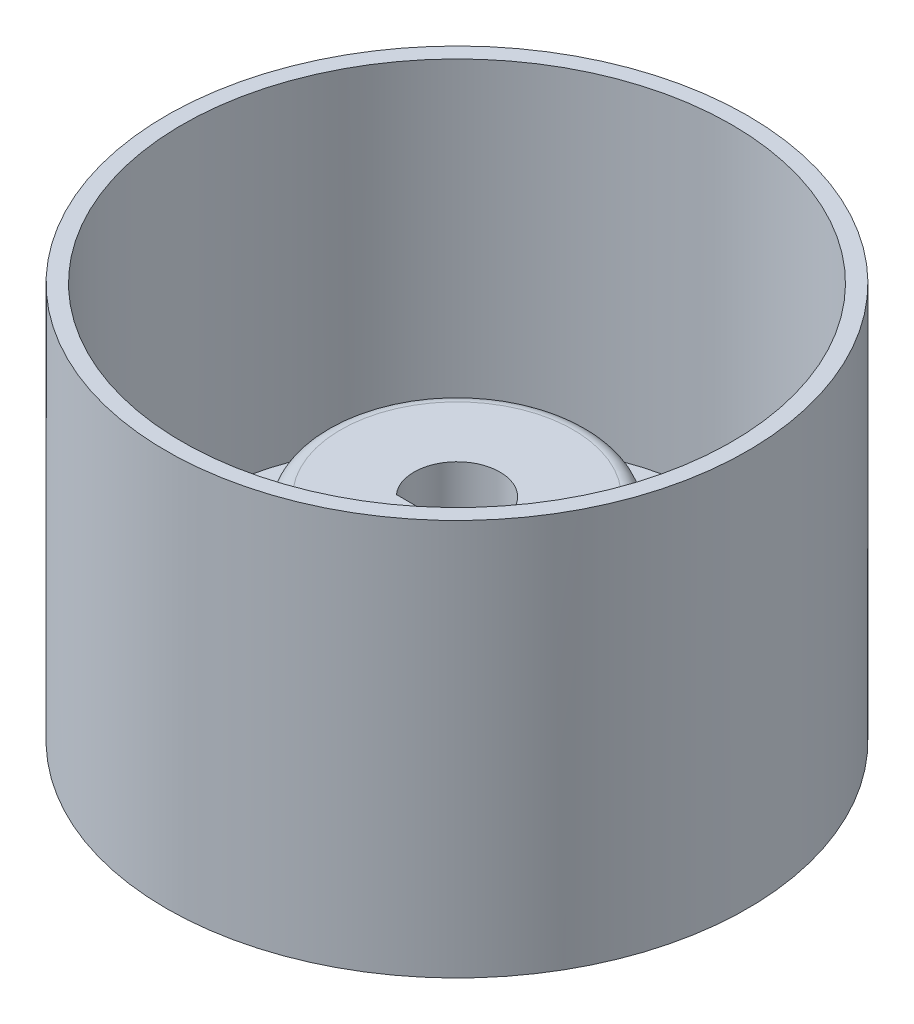
ISO-10303-21;
HEADER;
FILE_DESCRIPTION(('STEP AP214'),'2;1');
FILE_NAME('part.step','',(''),(''),'','','');
FILE_SCHEMA(('AUTOMOTIVE_DESIGN { 1 0 10303 214 1 1 1 1 }'));
ENDSEC;
DATA;
#1=APPLICATION_CONTEXT('core data for automotive mechanical design processes');
#2=APPLICATION_PROTOCOL_DEFINITION('international standard','automotive_design',2000,#1);
#3=PRODUCT_CONTEXT('',#1,'mechanical');
#4=PRODUCT('Part','Part','',(#3));
#5=PRODUCT_RELATED_PRODUCT_CATEGORY('part','',(#4));
#6=PRODUCT_DEFINITION_FORMATION('','',#4);
#7=PRODUCT_DEFINITION_CONTEXT('part definition',#1,'design');
#8=PRODUCT_DEFINITION('design','',#6,#7);
#9=PRODUCT_DEFINITION_SHAPE('','',#8);
#10=(LENGTH_UNIT() NAMED_UNIT(*) SI_UNIT(.MILLI.,.METRE.));
#11=(NAMED_UNIT(*) PLANE_ANGLE_UNIT() SI_UNIT($,.RADIAN.));
#12=(NAMED_UNIT(*) SI_UNIT($,.STERADIAN.) SOLID_ANGLE_UNIT());
#13=UNCERTAINTY_MEASURE_WITH_UNIT(LENGTH_MEASURE(1.E-05),#10,'distance_accuracy_value','');
#14=(GEOMETRIC_REPRESENTATION_CONTEXT(3) GLOBAL_UNCERTAINTY_ASSIGNED_CONTEXT((#13)) GLOBAL_UNIT_ASSIGNED_CONTEXT((#10,
#11,#12)) REPRESENTATION_CONTEXT('',''));
#15=CARTESIAN_POINT('',(0.,0.,0.));
#16=DIRECTION('',(0.,0.,1.));
#17=DIRECTION('',(1.,0.,0.));
#18=AXIS2_PLACEMENT_3D('',#15,#16,#17);
#19=CARTESIAN_POINT('',(0.,2.5,0.));
#20=DIRECTION('',(0.,1.,0.));
#21=DIRECTION('',(0.,0.,1.));
#22=AXIS2_PLACEMENT_3D('',#19,#20,#21);
#23=PLANE('',#22);
#24=CARTESIAN_POINT('',(-6.928203230275,2.5,4.0000000000003));
#25=DIRECTION('',(0.,1.,0.));
#26=DIRECTION('',(0.,0.,1.));
#27=AXIS2_PLACEMENT_3D('',#24,#25,#26);
#28=CIRCLE('',#27,1.53000000000065);
#29=CARTESIAN_POINT('',(-6.928203230275,2.5,5.53000000000094));
#30=VERTEX_POINT('',#29);
#31=EDGE_CURVE('E72',#30,#30,#28,.T.);
#32=ORIENTED_EDGE('',*,*,#31,.F.);
#33=EDGE_LOOP('',(#32));
#34=FACE_BOUND('',#33,.T.);
#35=CARTESIAN_POINT('',(6.92820323027602,2.5,3.9999999999997));
#36=DIRECTION('',(0.,1.,0.));
#37=DIRECTION('',(0.,0.,1.));
#38=AXIS2_PLACEMENT_3D('',#35,#36,#37);
#39=CIRCLE('',#38,1.53000000000044);
#40=CARTESIAN_POINT('',(6.92820323027602,2.5,5.53000000000014));
#41=VERTEX_POINT('',#40);
#42=EDGE_CURVE('E108',#41,#41,#39,.T.);
#43=ORIENTED_EDGE('',*,*,#42,.F.);
#44=EDGE_LOOP('',(#43));
#45=FACE_BOUND('',#44,.T.);
#46=CARTESIAN_POINT('',(0.,2.5,-8.));
#47=DIRECTION('',(0.,1.,0.));
#48=DIRECTION('',(0.,0.,1.));
#49=AXIS2_PLACEMENT_3D('',#46,#47,#48);
#50=CIRCLE('',#49,1.53);
#51=CARTESIAN_POINT('',(0.,2.5,-6.47));
#52=VERTEX_POINT('',#51);
#53=EDGE_CURVE('E100',#52,#52,#50,.T.);
#54=ORIENTED_EDGE('',*,*,#53,.F.);
#55=EDGE_LOOP('',(#54));
#56=FACE_BOUND('',#55,.T.);
#57=CARTESIAN_POINT('',(0.,2.5,0.));
#58=DIRECTION('',(0.,1.,0.));
#59=DIRECTION('',(0.,0.,1.));
#60=AXIS2_PLACEMENT_3D('',#57,#58,#59);
#61=CIRCLE('',#60,5.6);
#62=CARTESIAN_POINT('',(0.,2.5,5.6));
#63=VERTEX_POINT('',#62);
#64=EDGE_CURVE('E11',#63,#63,#61,.F.);
#65=ORIENTED_EDGE('',*,*,#64,.T.);
#66=EDGE_LOOP('',(#65));
#67=FACE_BOUND('',#66,.T.);
#68=CARTESIAN_POINT('',(0.,2.5,0.));
#69=DIRECTION('',(0.,1.,0.));
#70=DIRECTION('',(0.,0.,1.));
#71=AXIS2_PLACEMENT_3D('',#68,#69,#70);
#72=CIRCLE('',#71,10.4);
#73=CARTESIAN_POINT('',(0.,2.5,10.4));
#74=VERTEX_POINT('',#73);
#75=EDGE_CURVE('E83',#74,#74,#72,.T.);
#76=ORIENTED_EDGE('',*,*,#75,.T.);
#77=EDGE_LOOP('',(#76));
#78=FACE_BOUND('',#77,.T.);
#79=ADVANCED_FACE('F39',(#34,#45,#56,#67,#78),#23,.T.);
#80=CARTESIAN_POINT('',(0.,2.5,0.));
#81=DIRECTION('',(0.,-1.,0.));
#82=DIRECTION('',(0.,0.,-1.));
#83=AXIS2_PLACEMENT_3D('',#80,#81,#82);
#84=CYLINDRICAL_SURFACE('',#83,11.);
#85=CARTESIAN_POINT('',(0.,0.,0.));
#86=DIRECTION('',(0.,1.,0.));
#87=DIRECTION('',(0.,0.,1.));
#88=AXIS2_PLACEMENT_3D('',#85,#86,#87);
#89=CIRCLE('',#88,11.);
#90=CARTESIAN_POINT('',(0.,0.,11.));
#91=VERTEX_POINT('',#90);
#92=EDGE_CURVE('E99',#91,#91,#89,.T.);
#93=ORIENTED_EDGE('',*,*,#92,.T.);
#94=EDGE_LOOP('',(#93));
#95=FACE_BOUND('',#94,.T.);
#96=CARTESIAN_POINT('',(0.,15.,0.));
#97=DIRECTION('',(0.,-1.,0.));
#98=DIRECTION('',(0.,0.,-1.));
#99=AXIS2_PLACEMENT_3D('',#96,#97,#98);
#100=CIRCLE('',#99,11.);
#101=CARTESIAN_POINT('',(0.,15.,-11.));
#102=VERTEX_POINT('',#101);
#103=EDGE_CURVE('E87',#102,#102,#100,.T.);
#104=ORIENTED_EDGE('',*,*,#103,.T.);
#105=EDGE_LOOP('',(#104));
#106=FACE_BOUND('',#105,.T.);
#107=ADVANCED_FACE('F154',(#95,#106),#84,.T.);
#108=CARTESIAN_POINT('',(0.,0.,0.));
#109=DIRECTION('',(0.,1.,0.));
#110=DIRECTION('',(0.,0.,1.));
#111=AXIS2_PLACEMENT_3D('',#108,#109,#110);
#112=PLANE('',#111);
#113=ORIENTED_EDGE('',*,*,#92,.F.);
#114=EDGE_LOOP('',(#113));
#115=FACE_BOUND('',#114,.T.);
#116=CARTESIAN_POINT('',(-6.928203230275,0.,4.0000000000003));
#117=DIRECTION('',(0.,1.,0.));
#118=DIRECTION('',(0.,0.,1.));
#119=AXIS2_PLACEMENT_3D('',#116,#117,#118);
#120=CIRCLE('',#119,1.53000000000065);
#121=CARTESIAN_POINT('',(-6.928203230275,0.,5.53000000000094));
#122=VERTEX_POINT('',#121);
#123=EDGE_CURVE('E112',#122,#122,#120,.T.);
#124=ORIENTED_EDGE('',*,*,#123,.T.);
#125=EDGE_LOOP('',(#124));
#126=FACE_BOUND('',#125,.T.);
#127=CARTESIAN_POINT('',(6.92820323027602,0.,3.9999999999997));
#128=DIRECTION('',(0.,1.,0.));
#129=DIRECTION('',(0.,0.,1.));
#130=AXIS2_PLACEMENT_3D('',#127,#128,#129);
#131=CIRCLE('',#130,1.53000000000044);
#132=CARTESIAN_POINT('',(6.92820323027602,0.,5.53000000000014));
#133=VERTEX_POINT('',#132);
#134=EDGE_CURVE('E104',#133,#133,#131,.T.);
#135=ORIENTED_EDGE('',*,*,#134,.T.);
#136=EDGE_LOOP('',(#135));
#137=FACE_BOUND('',#136,.T.);
#138=CARTESIAN_POINT('',(0.,0.,-8.));
#139=DIRECTION('',(0.,1.,0.));
#140=DIRECTION('',(0.,0.,1.));
#141=AXIS2_PLACEMENT_3D('',#138,#139,#140);
#142=CIRCLE('',#141,1.53);
#143=CARTESIAN_POINT('',(0.,0.,-6.47));
#144=VERTEX_POINT('',#143);
#145=EDGE_CURVE('E95',#144,#144,#142,.T.);
#146=ORIENTED_EDGE('',*,*,#145,.T.);
#147=EDGE_LOOP('',(#146));
#148=FACE_BOUND('',#147,.T.);
#149=DIRECTION('',(1.,0.,0.));
#150=VECTOR('',#149,1.);
#151=CARTESIAN_POINT('',(-1.21860576069539,0.,1.075));
#152=LINE('',#151,#150);
#153=CARTESIAN_POINT('',(-1.21860576069539,0.,1.075));
#154=VERTEX_POINT('',#153);
#155=CARTESIAN_POINT('',(1.21860576069539,0.,1.075));
#156=VERTEX_POINT('',#155);
#157=EDGE_CURVE('E90',#154,#156,#152,.T.);
#158=ORIENTED_EDGE('',*,*,#157,.T.);
#159=CARTESIAN_POINT('',(0.,0.,0.));
#160=DIRECTION('',(0.,1.,0.));
#161=DIRECTION('',(0.,0.,1.));
#162=AXIS2_PLACEMENT_3D('',#159,#160,#161);
#163=CIRCLE('',#162,1.625);
#164=EDGE_CURVE('E55',#156,#154,#163,.T.);
#165=ORIENTED_EDGE('',*,*,#164,.T.);
#166=EDGE_LOOP('',(#158,#165));
#167=FACE_BOUND('',#166,.T.);
#168=ADVANCED_FACE('F151',(#115,#126,#137,#148,#167),#112,.F.);
#169=CARTESIAN_POINT('',(0.,8.,0.));
#170=DIRECTION('',(0.,-1.,0.));
#171=DIRECTION('',(0.,0.,-1.));
#172=AXIS2_PLACEMENT_3D('',#169,#170,#171);
#173=CYLINDRICAL_SURFACE('',#172,5.);
#174=CARTESIAN_POINT('',(0.,7.4,0.));
#175=DIRECTION('',(0.,1.,0.));
#176=DIRECTION('',(0.,0.,1.));
#177=AXIS2_PLACEMENT_3D('',#174,#175,#176);
#178=CIRCLE('',#177,5.);
#179=CARTESIAN_POINT('',(0.,7.4,5.));
#180=VERTEX_POINT('',#179);
#181=EDGE_CURVE('E48',#180,#180,#178,.F.);
#182=ORIENTED_EDGE('',*,*,#181,.T.);
#183=EDGE_LOOP('',(#182));
#184=FACE_BOUND('',#183,.T.);
#185=CARTESIAN_POINT('',(0.,3.1,0.));
#186=DIRECTION('',(0.,1.,0.));
#187=DIRECTION('',(0.,0.,1.));
#188=AXIS2_PLACEMENT_3D('',#185,#186,#187);
#189=CIRCLE('',#188,5.);
#190=CARTESIAN_POINT('',(0.,3.1,5.));
#191=VERTEX_POINT('',#190);
#192=EDGE_CURVE('E126',#191,#191,#189,.T.);
#193=ORIENTED_EDGE('',*,*,#192,.T.);
#194=EDGE_LOOP('',(#193));
#195=FACE_BOUND('',#194,.T.);
#196=ADVANCED_FACE('F133',(#184,#195),#173,.T.);
#197=CARTESIAN_POINT('',(0.,8.,0.));
#198=DIRECTION('',(0.,1.,0.));
#199=DIRECTION('',(0.,0.,1.));
#200=AXIS2_PLACEMENT_3D('',#197,#198,#199);
#201=PLANE('',#200);
#202=CARTESIAN_POINT('',(0.,8.,0.));
#203=DIRECTION('',(0.,1.,0.));
#204=DIRECTION('',(0.,0.,1.));
#205=AXIS2_PLACEMENT_3D('',#202,#203,#204);
#206=CIRCLE('',#205,4.4);
#207=CARTESIAN_POINT('',(0.,8.,4.4));
#208=VERTEX_POINT('',#207);
#209=EDGE_CURVE('E122',#208,#208,#206,.T.);
#210=ORIENTED_EDGE('',*,*,#209,.T.);
#211=EDGE_LOOP('',(#210));
#212=FACE_BOUND('',#211,.T.);
#213=CARTESIAN_POINT('',(0.,8.,0.));
#214=DIRECTION('',(0.,1.,0.));
#215=DIRECTION('',(0.,0.,1.));
#216=AXIS2_PLACEMENT_3D('',#213,#214,#215);
#217=CIRCLE('',#216,1.625);
#218=CARTESIAN_POINT('',(1.21860576069539,8.,1.075));
#219=VERTEX_POINT('',#218);
#220=CARTESIAN_POINT('',(-1.21860576069539,8.,1.075));
#221=VERTEX_POINT('',#220);
#222=EDGE_CURVE('E60',#219,#221,#217,.T.);
#223=ORIENTED_EDGE('',*,*,#222,.F.);
#224=DIRECTION('',(1.,0.,0.));
#225=VECTOR('',#224,1.);
#226=CARTESIAN_POINT('',(-1.21860576069539,8.,1.075));
#227=LINE('',#226,#225);
#228=EDGE_CURVE('E76',#221,#219,#227,.T.);
#229=ORIENTED_EDGE('',*,*,#228,.F.);
#230=EDGE_LOOP('',(#223,#229));
#231=FACE_BOUND('',#230,.T.);
#232=ADVANCED_FACE('F81',(#212,#231),#201,.T.);
#233=CARTESIAN_POINT('',(-6.928203230275,0.,4.0000000000003));
#234=DIRECTION('',(0.,1.,0.));
#235=DIRECTION('',(0.,0.,1.));
#236=AXIS2_PLACEMENT_3D('',#233,#234,#235);
#237=CYLINDRICAL_SURFACE('',#236,1.53000000000065);
#238=ORIENTED_EDGE('',*,*,#123,.F.);
#239=EDGE_LOOP('',(#238));
#240=FACE_BOUND('',#239,.T.);
#241=ORIENTED_EDGE('',*,*,#31,.T.);
#242=EDGE_LOOP('',(#241));
#243=FACE_BOUND('',#242,.T.);
#244=ADVANCED_FACE('F142',(#240,#243),#237,.F.);
#245=CARTESIAN_POINT('',(6.92820323027602,0.,3.9999999999997));
#246=DIRECTION('',(0.,1.,0.));
#247=DIRECTION('',(0.,0.,1.));
#248=AXIS2_PLACEMENT_3D('',#245,#246,#247);
#249=CYLINDRICAL_SURFACE('',#248,1.53000000000044);
#250=ORIENTED_EDGE('',*,*,#134,.F.);
#251=EDGE_LOOP('',(#250));
#252=FACE_BOUND('',#251,.T.);
#253=ORIENTED_EDGE('',*,*,#42,.T.);
#254=EDGE_LOOP('',(#253));
#255=FACE_BOUND('',#254,.T.);
#256=ADVANCED_FACE('F148',(#252,#255),#249,.F.);
#257=CARTESIAN_POINT('',(0.,0.,-8.));
#258=DIRECTION('',(0.,1.,0.));
#259=DIRECTION('',(0.,0.,1.));
#260=AXIS2_PLACEMENT_3D('',#257,#258,#259);
#261=CYLINDRICAL_SURFACE('',#260,1.53);
#262=ORIENTED_EDGE('',*,*,#145,.F.);
#263=EDGE_LOOP('',(#262));
#264=FACE_BOUND('',#263,.T.);
#265=ORIENTED_EDGE('',*,*,#53,.T.);
#266=EDGE_LOOP('',(#265));
#267=FACE_BOUND('',#266,.T.);
#268=ADVANCED_FACE('F205',(#264,#267),#261,.F.);
#269=CARTESIAN_POINT('',(0.,0.,0.));
#270=DIRECTION('',(0.,1.,0.));
#271=DIRECTION('',(0.,0.,1.));
#272=AXIS2_PLACEMENT_3D('',#269,#270,#271);
#273=CYLINDRICAL_SURFACE('',#272,1.625);
#274=ORIENTED_EDGE('',*,*,#222,.T.);
#275=DIRECTION('',(0.,1.,0.));
#276=VECTOR('',#275,1.);
#277=CARTESIAN_POINT('',(-1.21860576069539,0.,1.075));
#278=LINE('',#277,#276);
#279=EDGE_CURVE('E73',#154,#221,#278,.T.);
#280=ORIENTED_EDGE('',*,*,#279,.F.);
#281=ORIENTED_EDGE('',*,*,#164,.F.);
#282=DIRECTION('',(0.,1.,0.));
#283=VECTOR('',#282,1.);
#284=CARTESIAN_POINT('',(1.21860576069539,0.,1.075));
#285=LINE('',#284,#283);
#286=EDGE_CURVE('E65',#156,#219,#285,.T.);
#287=ORIENTED_EDGE('',*,*,#286,.T.);
#288=EDGE_LOOP('',(#274,#280,#281,#287));
#289=FACE_BOUND('',#288,.T.);
#290=ADVANCED_FACE('F67',(#289),#273,.F.);
#291=CARTESIAN_POINT('',(-1.21860576069539,0.,1.075));
#292=DIRECTION('',(0.,0.,1.));
#293=DIRECTION('',(1.,0.,0.));
#294=AXIS2_PLACEMENT_3D('',#291,#292,#293);
#295=PLANE('',#294);
#296=ORIENTED_EDGE('',*,*,#228,.T.);
#297=ORIENTED_EDGE('',*,*,#286,.F.);
#298=ORIENTED_EDGE('',*,*,#157,.F.);
#299=ORIENTED_EDGE('',*,*,#279,.T.);
#300=EDGE_LOOP('',(#296,#297,#298,#299));
#301=FACE_BOUND('',#300,.T.);
#302=ADVANCED_FACE('F77',(#301),#295,.F.);
#303=CARTESIAN_POINT('',(0.,7.4,0.));
#304=DIRECTION('',(0.,1.,0.));
#305=DIRECTION('',(0.,0.,1.));
#306=AXIS2_PLACEMENT_3D('',#303,#304,#305);
#307=TOROIDAL_SURFACE('',#306,4.4,0.6);
#308=ORIENTED_EDGE('',*,*,#181,.F.);
#309=EDGE_LOOP('',(#308));
#310=FACE_BOUND('',#309,.T.);
#311=ORIENTED_EDGE('',*,*,#209,.F.);
#312=EDGE_LOOP('',(#311));
#313=FACE_BOUND('',#312,.T.);
#314=ADVANCED_FACE('F136',(#310,#313),#307,.T.);
#315=CARTESIAN_POINT('',(0.,3.1,0.));
#316=DIRECTION('',(0.,1.,0.));
#317=DIRECTION('',(0.,0.,1.));
#318=AXIS2_PLACEMENT_3D('',#315,#316,#317);
#319=TOROIDAL_SURFACE('',#318,5.6,0.6);
#320=ORIENTED_EDGE('',*,*,#64,.F.);
#321=EDGE_LOOP('',(#320));
#322=FACE_BOUND('',#321,.T.);
#323=ORIENTED_EDGE('',*,*,#192,.F.);
#324=EDGE_LOOP('',(#323));
#325=FACE_BOUND('',#324,.T.);
#326=ADVANCED_FACE('F41',(#322,#325),#319,.F.);
#327=CARTESIAN_POINT('',(0.,15.,0.));
#328=DIRECTION('',(0.,-1.,0.));
#329=DIRECTION('',(0.,0.,-1.));
#330=AXIS2_PLACEMENT_3D('',#327,#328,#329);
#331=PLANE('',#330);
#332=CARTESIAN_POINT('',(0.,15.,0.));
#333=DIRECTION('',(0.,-1.,0.));
#334=DIRECTION('',(0.,0.,-1.));
#335=AXIS2_PLACEMENT_3D('',#332,#333,#334);
#336=CIRCLE('',#335,10.4);
#337=CARTESIAN_POINT('',(0.,15.,-10.4));
#338=VERTEX_POINT('',#337);
#339=EDGE_CURVE('E183',#338,#338,#336,.T.);
#340=ORIENTED_EDGE('',*,*,#339,.T.);
#341=EDGE_LOOP('',(#340));
#342=FACE_BOUND('',#341,.T.);
#343=ORIENTED_EDGE('',*,*,#103,.F.);
#344=EDGE_LOOP('',(#343));
#345=FACE_BOUND('',#344,.T.);
#346=ADVANCED_FACE('F188',(#342,#345),#331,.F.);
#347=CARTESIAN_POINT('',(0.,15.,0.));
#348=DIRECTION('',(0.,-1.,0.));
#349=DIRECTION('',(0.,0.,-1.));
#350=AXIS2_PLACEMENT_3D('',#347,#348,#349);
#351=CYLINDRICAL_SURFACE('',#350,10.4);
#352=ORIENTED_EDGE('',*,*,#75,.F.);
#353=EDGE_LOOP('',(#352));
#354=FACE_BOUND('',#353,.T.);
#355=ORIENTED_EDGE('',*,*,#339,.F.);
#356=EDGE_LOOP('',(#355));
#357=FACE_BOUND('',#356,.T.);
#358=ADVANCED_FACE('F191',(#354,#357),#351,.F.);
#359=CLOSED_SHELL('',(#79,#107,#168,#196,#232,#244,#256,#268,#290,#302,#314,#326,#346,#358));
#360=MANIFOLD_SOLID_BREP('B2',#359);
#361=ADVANCED_BREP_SHAPE_REPRESENTATION('',(#18,#360),#14);
#362=SHAPE_DEFINITION_REPRESENTATION(#9,#361);
ENDSEC;
END-ISO-10303-21;
